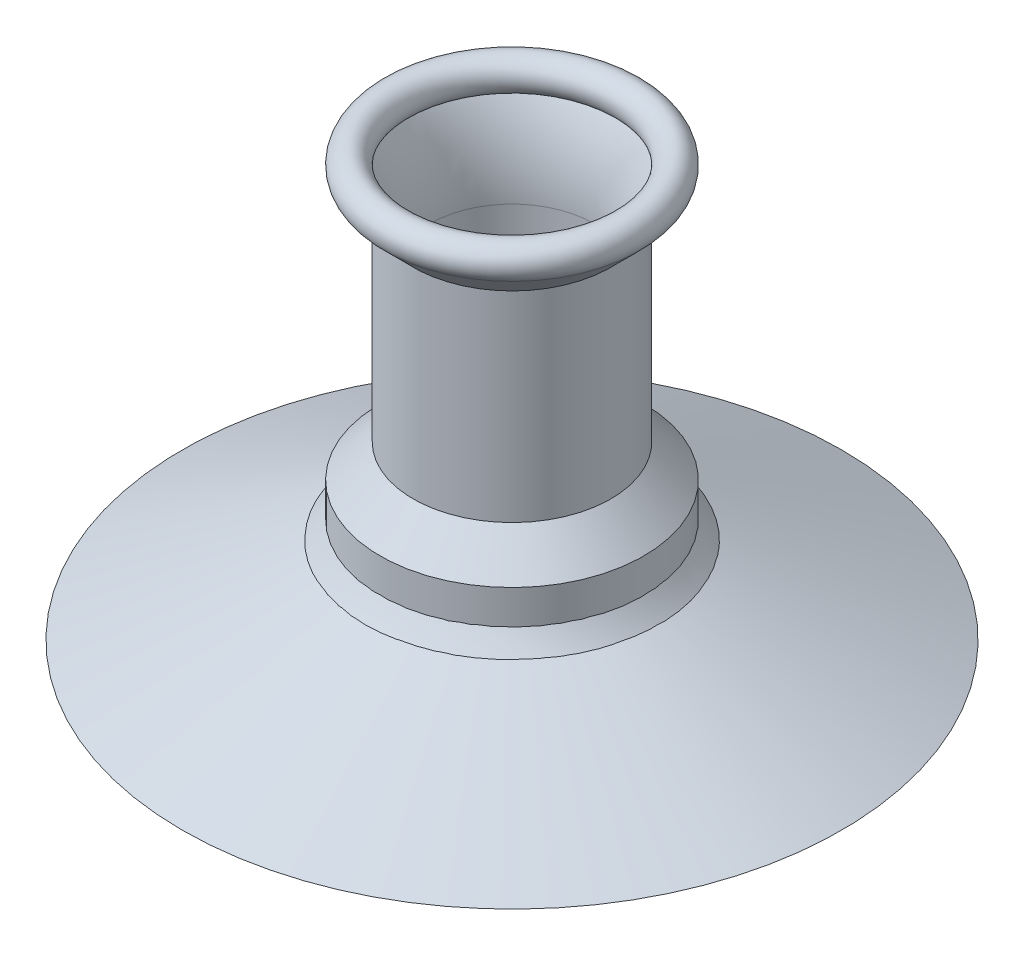
ISO-10303-21;
HEADER;
FILE_DESCRIPTION(('STEP AP214'),'2;1');
FILE_NAME('part.step','',(''),(''),'','','');
FILE_SCHEMA(('AUTOMOTIVE_DESIGN { 1 0 10303 214 1 1 1 1 }'));
ENDSEC;
DATA;
#1=APPLICATION_CONTEXT('core data for automotive mechanical design processes');
#2=APPLICATION_PROTOCOL_DEFINITION('international standard','automotive_design',2000,#1);
#3=PRODUCT_CONTEXT('',#1,'mechanical');
#4=PRODUCT('Part','Part','',(#3));
#5=PRODUCT_RELATED_PRODUCT_CATEGORY('part','',(#4));
#6=PRODUCT_DEFINITION_FORMATION('','',#4);
#7=PRODUCT_DEFINITION_CONTEXT('part definition',#1,'design');
#8=PRODUCT_DEFINITION('design','',#6,#7);
#9=PRODUCT_DEFINITION_SHAPE('','',#8);
#10=(LENGTH_UNIT() NAMED_UNIT(*) SI_UNIT(.MILLI.,.METRE.));
#11=(NAMED_UNIT(*) PLANE_ANGLE_UNIT() SI_UNIT($,.RADIAN.));
#12=(NAMED_UNIT(*) SI_UNIT($,.STERADIAN.) SOLID_ANGLE_UNIT());
#13=UNCERTAINTY_MEASURE_WITH_UNIT(LENGTH_MEASURE(1.E-05),#10,'distance_accuracy_value','');
#14=(GEOMETRIC_REPRESENTATION_CONTEXT(3) GLOBAL_UNCERTAINTY_ASSIGNED_CONTEXT((#13)) GLOBAL_UNIT_ASSIGNED_CONTEXT((#10,
#11,#12)) REPRESENTATION_CONTEXT('',''));
#15=CARTESIAN_POINT('',(0.,0.,0.));
#16=DIRECTION('',(0.,0.,1.));
#17=DIRECTION('',(1.,0.,0.));
#18=AXIS2_PLACEMENT_3D('',#15,#16,#17);
#19=CARTESIAN_POINT('',(0.,0.,0.));
#20=DIRECTION('',(0.,-1.,0.));
#21=DIRECTION('',(0.,0.,-1.));
#22=AXIS2_PLACEMENT_3D('',#19,#20,#21);
#23=CONICAL_SURFACE('',#22,20.,1.12824593555333);
#24=CARTESIAN_POINT('',(0.,5.68679909824493,0.));
#25=DIRECTION('',(0.,-1.,0.));
#26=DIRECTION('',(0.,0.,-1.));
#27=AXIS2_PLACEMENT_3D('',#24,#25,#26);
#28=CIRCLE('',#27,8.);
#29=CARTESIAN_POINT('',(0.,5.68679909824493,-8.));
#30=VERTEX_POINT('',#29);
#31=EDGE_CURVE('E47',#30,#30,#28,.T.);
#32=ORIENTED_EDGE('',*,*,#31,.T.);
#33=EDGE_LOOP('',(#32));
#34=FACE_BOUND('',#33,.T.);
#35=CARTESIAN_POINT('',(0.,0.,0.));
#36=DIRECTION('',(0.,-1.,0.));
#37=DIRECTION('',(0.,0.,-1.));
#38=AXIS2_PLACEMENT_3D('',#35,#36,#37);
#39=CIRCLE('',#38,20.);
#40=CARTESIAN_POINT('',(0.,0.,-20.));
#41=VERTEX_POINT('',#40);
#42=EDGE_CURVE('E65',#41,#41,#39,.T.);
#43=ORIENTED_EDGE('',*,*,#42,.F.);
#44=EDGE_LOOP('',(#43));
#45=FACE_BOUND('',#44,.T.);
#46=ADVANCED_FACE('F30',(#34,#45),#23,.T.);
#47=CARTESIAN_POINT('',(0.,0.,0.));
#48=DIRECTION('',(0.,-1.,0.));
#49=DIRECTION('',(0.,0.,-1.));
#50=AXIS2_PLACEMENT_3D('',#47,#48,#49);
#51=CYLINDRICAL_SURFACE('',#50,8.);
#52=CARTESIAN_POINT('',(0.,8.4142135623731,0.));
#53=DIRECTION('',(0.,-1.,0.));
#54=DIRECTION('',(0.,0.,-1.));
#55=AXIS2_PLACEMENT_3D('',#52,#53,#54);
#56=CIRCLE('',#55,8.);
#57=CARTESIAN_POINT('',(0.,8.4142135623731,-8.));
#58=VERTEX_POINT('',#57);
#59=EDGE_CURVE('E50',#58,#58,#56,.T.);
#60=ORIENTED_EDGE('',*,*,#59,.T.);
#61=EDGE_LOOP('',(#60));
#62=FACE_BOUND('',#61,.T.);
#63=ORIENTED_EDGE('',*,*,#31,.F.);
#64=EDGE_LOOP('',(#63));
#65=FACE_BOUND('',#64,.T.);
#66=ADVANCED_FACE('F86',(#62,#65),#51,.T.);
#67=CARTESIAN_POINT('',(0.,8.4142135623731,0.));
#68=DIRECTION('',(0.,-1.,0.));
#69=DIRECTION('',(0.,0.,-1.));
#70=AXIS2_PLACEMENT_3D('',#67,#68,#69);
#71=CONICAL_SURFACE('',#70,8.,0.785398163397448);
#72=CARTESIAN_POINT('',(0.,10.4142135623731,0.));
#73=DIRECTION('',(0.,-1.,0.));
#74=DIRECTION('',(0.,0.,-1.));
#75=AXIS2_PLACEMENT_3D('',#72,#73,#74);
#76=CIRCLE('',#75,6.);
#77=CARTESIAN_POINT('',(0.,10.4142135623731,-6.));
#78=VERTEX_POINT('',#77);
#79=EDGE_CURVE('E53',#78,#78,#76,.T.);
#80=ORIENTED_EDGE('',*,*,#79,.T.);
#81=EDGE_LOOP('',(#80));
#82=FACE_BOUND('',#81,.T.);
#83=ORIENTED_EDGE('',*,*,#59,.F.);
#84=EDGE_LOOP('',(#83));
#85=FACE_BOUND('',#84,.T.);
#86=ADVANCED_FACE('F92',(#82,#85),#71,.T.);
#87=CARTESIAN_POINT('',(0.,0.,0.));
#88=DIRECTION('',(0.,-1.,0.));
#89=DIRECTION('',(0.,0.,-1.));
#90=AXIS2_PLACEMENT_3D('',#87,#88,#89);
#91=CYLINDRICAL_SURFACE('',#90,6.);
#92=CARTESIAN_POINT('',(0.,22.5857864376269,0.));
#93=DIRECTION('',(0.,-1.,0.));
#94=DIRECTION('',(0.,0.,-1.));
#95=AXIS2_PLACEMENT_3D('',#92,#93,#94);
#96=CIRCLE('',#95,6.);
#97=CARTESIAN_POINT('',(0.,22.5857864376269,-6.));
#98=VERTEX_POINT('',#97);
#99=EDGE_CURVE('E56',#98,#98,#96,.T.);
#100=ORIENTED_EDGE('',*,*,#99,.T.);
#101=EDGE_LOOP('',(#100));
#102=FACE_BOUND('',#101,.T.);
#103=ORIENTED_EDGE('',*,*,#79,.F.);
#104=EDGE_LOOP('',(#103));
#105=FACE_BOUND('',#104,.T.);
#106=ADVANCED_FACE('F99',(#102,#105),#91,.T.);
#107=CARTESIAN_POINT('',(0.,22.5857864376269,0.));
#108=DIRECTION('',(0.,1.,0.));
#109=DIRECTION('',(0.,0.,1.));
#110=AXIS2_PLACEMENT_3D('',#107,#108,#109);
#111=CONICAL_SURFACE('',#110,6.,0.785398163397448);
#112=CARTESIAN_POINT('',(0.,24.2928932188135,0.));
#113=DIRECTION('',(0.,-1.,0.));
#114=DIRECTION('',(0.,0.,-1.));
#115=AXIS2_PLACEMENT_3D('',#112,#113,#114);
#116=CIRCLE('',#115,7.70710678118655);
#117=CARTESIAN_POINT('',(0.,24.2928932188135,-7.70710678118655));
#118=VERTEX_POINT('',#117);
#119=EDGE_CURVE('E59',#118,#118,#116,.T.);
#120=ORIENTED_EDGE('',*,*,#119,.T.);
#121=EDGE_LOOP('',(#120));
#122=FACE_BOUND('',#121,.T.);
#123=ORIENTED_EDGE('',*,*,#99,.F.);
#124=EDGE_LOOP('',(#123));
#125=FACE_BOUND('',#124,.T.);
#126=ADVANCED_FACE('F103',(#122,#125),#111,.T.);
#127=CARTESIAN_POINT('',(0.,25.,0.));
#128=DIRECTION('',(0.,-1.,0.));
#129=DIRECTION('',(0.,0.,-1.));
#130=AXIS2_PLACEMENT_3D('',#127,#128,#129);
#131=TOROIDAL_SURFACE('',#130,7.,1.);
#132=CARTESIAN_POINT('',(0.,24.2928932188135,0.));
#133=DIRECTION('',(0.,-1.,0.));
#134=DIRECTION('',(0.,0.,-1.));
#135=AXIS2_PLACEMENT_3D('',#132,#133,#134);
#136=CIRCLE('',#135,6.29289321881345);
#137=CARTESIAN_POINT('',(0.,24.2928932188135,-6.29289321881345));
#138=VERTEX_POINT('',#137);
#139=EDGE_CURVE('E62',#138,#138,#136,.T.);
#140=ORIENTED_EDGE('',*,*,#139,.T.);
#141=EDGE_LOOP('',(#140));
#142=FACE_BOUND('',#141,.T.);
#143=ORIENTED_EDGE('',*,*,#119,.F.);
#144=EDGE_LOOP('',(#143));
#145=FACE_BOUND('',#144,.T.);
#146=ADVANCED_FACE('F107',(#142,#145),#131,.T.);
#147=CARTESIAN_POINT('',(0.,0.,0.));
#148=DIRECTION('',(0.,-1.,0.));
#149=DIRECTION('',(0.,0.,-1.));
#150=AXIS2_PLACEMENT_3D('',#147,#148,#149);
#151=CYLINDRICAL_SURFACE('',#150,5.);
#152=CARTESIAN_POINT('',(0.,19.3749371900333,0.));
#153=DIRECTION('',(0.,1.,0.));
#154=DIRECTION('',(0.,0.,1.));
#155=AXIS2_PLACEMENT_3D('',#152,#153,#154);
#156=CIRCLE('',#155,5.);
#157=CARTESIAN_POINT('',(0.,19.3749371900333,5.));
#158=VERTEX_POINT('',#157);
#159=EDGE_CURVE('E38',#158,#158,#156,.T.);
#160=ORIENTED_EDGE('',*,*,#159,.T.);
#161=EDGE_LOOP('',(#160));
#162=FACE_BOUND('',#161,.T.);
#163=CARTESIAN_POINT('',(0.,14.,0.));
#164=DIRECTION('',(0.,-1.,0.));
#165=DIRECTION('',(0.,0.,-1.));
#166=AXIS2_PLACEMENT_3D('',#163,#164,#165);
#167=CIRCLE('',#166,5.);
#168=CARTESIAN_POINT('',(0.,14.,-5.));
#169=VERTEX_POINT('',#168);
#170=EDGE_CURVE('E42',#169,#169,#167,.T.);
#171=ORIENTED_EDGE('',*,*,#170,.T.);
#172=EDGE_LOOP('',(#171));
#173=FACE_BOUND('',#172,.T.);
#174=ADVANCED_FACE('F111',(#162,#173),#151,.F.);
#175=CARTESIAN_POINT('',(0.,5.,0.));
#176=DIRECTION('',(0.,-1.,0.));
#177=DIRECTION('',(0.,0.,-1.));
#178=AXIS2_PLACEMENT_3D('',#175,#176,#177);
#179=CONICAL_SURFACE('',#178,7.,1.20362249297668);
#180=CARTESIAN_POINT('',(0.,2.89536252373086,0.));
#181=DIRECTION('',(0.,-1.,0.));
#182=DIRECTION('',(0.,0.,-1.));
#183=AXIS2_PLACEMENT_3D('',#180,#181,#182);
#184=CIRCLE('',#183,12.4720574382998);
#185=CARTESIAN_POINT('',(0.,2.89536252373086,-12.4720574382998));
#186=VERTEX_POINT('',#185);
#187=EDGE_CURVE('E10',#186,#186,#184,.F.);
#188=ORIENTED_EDGE('',*,*,#187,.T.);
#189=EDGE_LOOP('',(#188));
#190=FACE_BOUND('',#189,.T.);
#191=ORIENTED_EDGE('',*,*,#42,.T.);
#192=EDGE_LOOP('',(#191));
#193=FACE_BOUND('',#192,.T.);
#194=ADVANCED_FACE('F82',(#190,#193),#179,.F.);
#195=CARTESIAN_POINT('',(0.,19.3749371900333,0.));
#196=DIRECTION('',(0.,1.,0.));
#197=DIRECTION('',(0.,0.,1.));
#198=AXIS2_PLACEMENT_3D('',#195,#196,#197);
#199=TOROIDAL_SURFACE('',#198,15.,10.);
#200=ORIENTED_EDGE('',*,*,#159,.F.);
#201=EDGE_LOOP('',(#200));
#202=FACE_BOUND('',#201,.T.);
#203=ORIENTED_EDGE('',*,*,#139,.F.);
#204=EDGE_LOOP('',(#203));
#205=FACE_BOUND('',#204,.T.);
#206=ADVANCED_FACE('F76',(#202,#205),#199,.T.);
#207=CARTESIAN_POINT('',(0.,12.2288185857614,0.));
#208=DIRECTION('',(0.,1.,0.));
#209=DIRECTION('',(0.,0.,1.));
#210=AXIS2_PLACEMENT_3D('',#207,#208,#209);
#211=TOROIDAL_SURFACE('',#210,16.0618482313885,10.);
#212=ORIENTED_EDGE('',*,*,#187,.F.);
#213=EDGE_LOOP('',(#212));
#214=FACE_BOUND('',#213,.T.);
#215=CARTESIAN_POINT('',(0.,8.,0.));
#216=DIRECTION('',(0.,-1.,0.));
#217=DIRECTION('',(0.,0.,-1.));
#218=AXIS2_PLACEMENT_3D('',#215,#216,#217);
#219=CIRCLE('',#218,7.);
#220=CARTESIAN_POINT('',(0.,8.,-7.));
#221=VERTEX_POINT('',#220);
#222=EDGE_CURVE('E34',#221,#221,#219,.T.);
#223=ORIENTED_EDGE('',*,*,#222,.F.);
#224=EDGE_LOOP('',(#223));
#225=FACE_BOUND('',#224,.T.);
#226=ADVANCED_FACE('F32',(#214,#225),#211,.T.);
#227=CARTESIAN_POINT('',(0.,14.,0.));
#228=DIRECTION('',(0.,-1.,0.));
#229=DIRECTION('',(0.,0.,-1.));
#230=AXIS2_PLACEMENT_3D('',#227,#228,#229);
#231=TOROIDAL_SURFACE('',#230,15.,10.);
#232=ORIENTED_EDGE('',*,*,#222,.T.);
#233=EDGE_LOOP('',(#232));
#234=FACE_BOUND('',#233,.T.);
#235=ORIENTED_EDGE('',*,*,#170,.F.);
#236=EDGE_LOOP('',(#235));
#237=FACE_BOUND('',#236,.T.);
#238=ADVANCED_FACE('F72',(#234,#237),#231,.T.);
#239=CLOSED_SHELL('',(#46,#66,#86,#106,#126,#146,#174,#194,#206,#226,#238));
#240=MANIFOLD_SOLID_BREP('B2',#239);
#241=ADVANCED_BREP_SHAPE_REPRESENTATION('',(#18,#240),#14);
#242=SHAPE_DEFINITION_REPRESENTATION(#9,#241);
ENDSEC;
END-ISO-10303-21;
